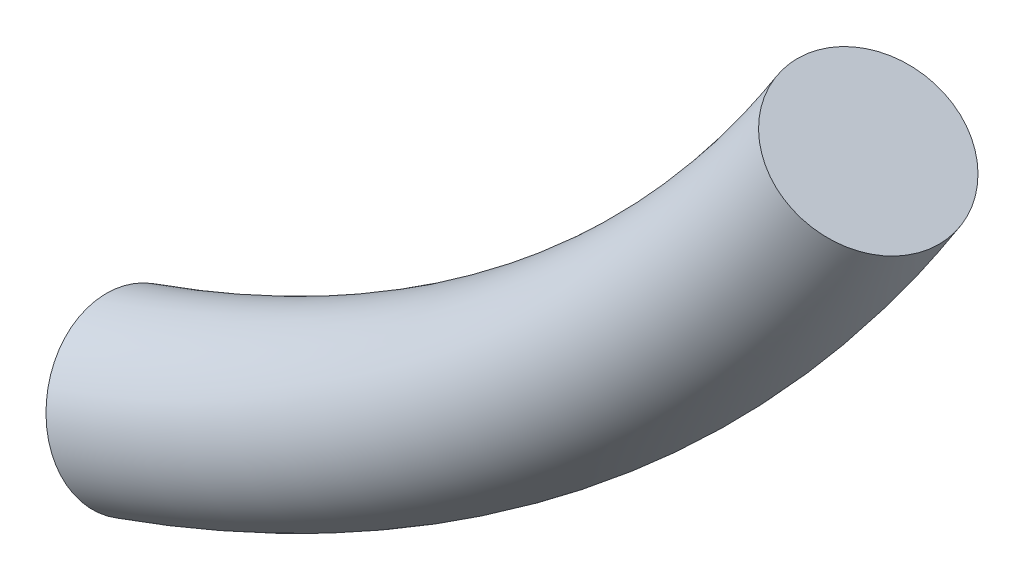
ISO-10303-21;
HEADER;
FILE_DESCRIPTION(('STEP AP214'),'2;1');
FILE_NAME('part.step','',(''),(''),'','','');
FILE_SCHEMA(('AUTOMOTIVE_DESIGN { 1 0 10303 214 1 1 1 1 }'));
ENDSEC;
DATA;
#1=APPLICATION_CONTEXT('core data for automotive mechanical design processes');
#2=APPLICATION_PROTOCOL_DEFINITION('international standard','automotive_design',2000,#1);
#3=PRODUCT_CONTEXT('',#1,'mechanical');
#4=PRODUCT('Part','Part','',(#3));
#5=PRODUCT_RELATED_PRODUCT_CATEGORY('part','',(#4));
#6=PRODUCT_DEFINITION_FORMATION('','',#4);
#7=PRODUCT_DEFINITION_CONTEXT('part definition',#1,'design');
#8=PRODUCT_DEFINITION('design','',#6,#7);
#9=PRODUCT_DEFINITION_SHAPE('','',#8);
#10=(LENGTH_UNIT() NAMED_UNIT(*) SI_UNIT(.MILLI.,.METRE.));
#11=(NAMED_UNIT(*) PLANE_ANGLE_UNIT() SI_UNIT($,.RADIAN.));
#12=(NAMED_UNIT(*) SI_UNIT($,.STERADIAN.) SOLID_ANGLE_UNIT());
#13=UNCERTAINTY_MEASURE_WITH_UNIT(LENGTH_MEASURE(1.E-05),#10,'distance_accuracy_value','');
#14=(GEOMETRIC_REPRESENTATION_CONTEXT(3) GLOBAL_UNCERTAINTY_ASSIGNED_CONTEXT((#13)) GLOBAL_UNIT_ASSIGNED_CONTEXT((#10,
#11,#12)) REPRESENTATION_CONTEXT('',''));
#15=CARTESIAN_POINT('',(0.,0.,0.));
#16=DIRECTION('',(0.,0.,1.));
#17=DIRECTION('',(1.,0.,0.));
#18=AXIS2_PLACEMENT_3D('',#15,#16,#17);
#19=CARTESIAN_POINT('',(0.,0.,-107.5));
#20=DIRECTION('',(-0.942862382947884,-0.333182422738413,0.));
#21=DIRECTION('',(0.333182422738413,-0.942862382947884,0.));
#22=AXIS2_PLACEMENT_3D('',#19,#20,#21);
#23=PLANE('',#22);
#24=CARTESIAN_POINT('',(2.41962933421589,-6.84723239947315,-102.2302));
#25=CARTESIAN_POINT('',(2.41962871926832,-6.84723065925251,-102.25265524156));
#26=CARTESIAN_POINT('',(2.41899700473931,-6.84544299031946,-102.275130857259));
#27=CARTESIAN_POINT('',(2.41648383930042,-6.83833106306059,-102.319482451298));
#28=CARTESIAN_POINT('',(2.41459971367299,-6.83299923563628,-102.341357041711));
#29=CARTESIAN_POINT('',(2.40963785801838,-6.81895783750999,-102.383809618347));
#30=CARTESIAN_POINT('',(2.40656225836532,-6.81025429548624,-102.404389843003));
#31=CARTESIAN_POINT('',(2.39929905568181,-6.78970038830917,-102.443737337222));
#32=CARTESIAN_POINT('',(2.39510987515017,-6.77784555903515,-102.46250198299));
#33=CARTESIAN_POINT('',(2.38574734664067,-6.75135083620936,-102.497627484938));
#34=CARTESIAN_POINT('',(2.38057539472916,-6.73671489334148,-102.513991693303));
#35=CARTESIAN_POINT('',(2.36938219244588,-6.70503960479868,-102.543904884907));
#36=CARTESIAN_POINT('',(2.36335976327552,-6.68799692327894,-102.557449895039));
#37=CARTESIAN_POINT('',(2.35064698076117,-6.65202142278026,-102.581301941874));
#38=CARTESIAN_POINT('',(2.34395711710098,-6.63308998954198,-102.5916113298));
#39=CARTESIAN_POINT('',(2.33009526466667,-6.59386277247914,-102.608713483024));
#40=CARTESIAN_POINT('',(2.32292324755682,-6.57356690846817,-102.615506041437));
#41=CARTESIAN_POINT('',(2.30830127034133,-6.53218863836769,-102.625380612929));
#42=CARTESIAN_POINT('',(2.30085131841581,-6.51110625542681,-102.628462735124));
#43=CARTESIAN_POINT('',(2.28588475233424,-6.46875284421071,-102.630829316177));
#44=CARTESIAN_POINT('',(2.27836813817819,-6.44748181593549,-102.630113775036));
#45=CARTESIAN_POINT('',(2.26348140012424,-6.40535430752582,-102.624905254934));
#46=CARTESIAN_POINT('',(2.25611128054104,-6.38449783960139,-102.620412164882));
#47=CARTESIAN_POINT('',(2.24172742311352,-6.34379341714529,-102.607776350926));
#48=CARTESIAN_POINT('',(2.23471366433335,-6.3239454033679,-102.599633841699));
#49=CARTESIAN_POINT('',(2.22123620327127,-6.28580596327187,-102.579923114515));
#50=CARTESIAN_POINT('',(2.21477290564648,-6.2675156820796,-102.568352403919));
#51=CARTESIAN_POINT('',(2.20259441310781,-6.23305215185689,-102.542134850302));
#52=CARTESIAN_POINT('',(2.19687818501873,-6.21687597907669,-102.527492330157));
#53=CARTESIAN_POINT('',(2.18633774988249,-6.18704793560373,-102.495513974748));
#54=CARTESIAN_POINT('',(2.18151481381394,-6.1733996616131,-102.478174365578));
#55=CARTESIAN_POINT('',(2.17291427173499,-6.1490612600475,-102.441335318358));
#56=CARTESIAN_POINT('',(2.16913518881484,-6.13836695301243,-102.421838987082));
#57=CARTESIAN_POINT('',(2.16271454541356,-6.120197377656,-102.381186262625));
#58=CARTESIAN_POINT('',(2.1600750251459,-6.11272788287008,-102.36002697154));
#59=CARTESIAN_POINT('',(2.15602303202312,-6.10126127589834,-102.316713490036));
#60=CARTESIAN_POINT('',(2.15460794784839,-6.09725677402189,-102.294561523395));
#61=CARTESIAN_POINT('',(2.15332930275961,-6.0936383767924,-102.258269762147));
#62=CARTESIAN_POINT('',(2.15308301156416,-6.09294140514085,-102.244238862858));
#63=CARTESIAN_POINT('',(2.15308401097272,-6.09294423333549,-102.20774475844));
#64=CARTESIAN_POINT('',(2.15371572550174,-6.09473190226854,-102.185269142741));
#65=CARTESIAN_POINT('',(2.15622889094062,-6.10184382952741,-102.140917548703));
#66=CARTESIAN_POINT('',(2.15811301656806,-6.10717565695172,-102.119042958289));
#67=CARTESIAN_POINT('',(2.16307487222267,-6.12121705507801,-102.076590381653));
#68=CARTESIAN_POINT('',(2.16615047187573,-6.12992059710176,-102.056010156997));
#69=CARTESIAN_POINT('',(2.17341367455923,-6.15047450427884,-102.016662662778));
#70=CARTESIAN_POINT('',(2.17760285509088,-6.16232933355285,-101.99789801701));
#71=CARTESIAN_POINT('',(2.18696538360038,-6.18882405637865,-101.962772515062));
#72=CARTESIAN_POINT('',(2.19213733551188,-6.20345999924652,-101.946408306697));
#73=CARTESIAN_POINT('',(2.20333053779516,-6.23513528778932,-101.916495115093));
#74=CARTESIAN_POINT('',(2.20935296696553,-6.25217796930906,-101.902950104961));
#75=CARTESIAN_POINT('',(2.22206574947988,-6.28815346980774,-101.879098058126));
#76=CARTESIAN_POINT('',(2.22875561314007,-6.30708490304603,-101.8687886702));
#77=CARTESIAN_POINT('',(2.24261746557437,-6.34631212010886,-101.851686516976));
#78=CARTESIAN_POINT('',(2.24978948268423,-6.36660798411983,-101.844893958563));
#79=CARTESIAN_POINT('',(2.26441145989971,-6.40798625422031,-101.835019387071));
#80=CARTESIAN_POINT('',(2.27186141182523,-6.42906863716119,-101.831937264876));
#81=CARTESIAN_POINT('',(2.28682797790681,-6.47142204837729,-101.829570683823));
#82=CARTESIAN_POINT('',(2.29434459206286,-6.49269307665252,-101.830286224964));
#83=CARTESIAN_POINT('',(2.30923133011681,-6.53482058506219,-101.835494745066));
#84=CARTESIAN_POINT('',(2.31660144970001,-6.55567705298661,-101.839987835118));
#85=CARTESIAN_POINT('',(2.33098530712752,-6.59638147544271,-101.852623649074));
#86=CARTESIAN_POINT('',(2.33799906590769,-6.6162294892201,-101.860766158301));
#87=CARTESIAN_POINT('',(2.35147652696978,-6.65436892931613,-101.880476885485));
#88=CARTESIAN_POINT('',(2.35793982459457,-6.6726592105084,-101.892047596081));
#89=CARTESIAN_POINT('',(2.37011831713323,-6.70712274073111,-101.918265149698));
#90=CARTESIAN_POINT('',(2.37583454522231,-6.72329891351131,-101.932907669844));
#91=CARTESIAN_POINT('',(2.38637498035855,-6.75312695698426,-101.964886025252));
#92=CARTESIAN_POINT('',(2.3911979164271,-6.7667752309749,-101.982225634422));
#93=CARTESIAN_POINT('',(2.39979845850606,-6.7911136325405,-102.019064681642));
#94=CARTESIAN_POINT('',(2.40357754142621,-6.80180793957556,-102.038561012918));
#95=CARTESIAN_POINT('',(2.40999818482748,-6.81997751493199,-102.079213737375));
#96=CARTESIAN_POINT('',(2.41263770509514,-6.82744700971792,-102.10037302846));
#97=CARTESIAN_POINT('',(2.41668969821792,-6.83891361668966,-102.143686509964));
#98=CARTESIAN_POINT('',(2.41810478239265,-6.84291811856611,-102.165838476605));
#99=CARTESIAN_POINT('',(2.41938342748143,-6.8465365157956,-102.202130237853));
#100=CARTESIAN_POINT('',(2.41962971867688,-6.84723348744715,-102.216161137143));
#101=CARTESIAN_POINT('',(2.41962933421589,-6.84723239947315,-102.2302));
#102=B_SPLINE_CURVE_WITH_KNOTS('',3,(#24,#25,#26,#27,#28,#29,#30,#31,#32,#33,#34,#35,#36,#37,
#38,#39,#40,#41,#42,#43,#44,#45,#46,#47,#48,#49,#50,#51,#52,#53,#54,#55,#56,#57,#58,#59,#60,#61,
#62,#63,#64,#65,#66,#67,#68,#69,#70,#71,#72,#73,#74,#75,#76,#77,#78,#79,#80,#81,#82,#83,#84,#85,
#86,#87,#88,#89,#90,#91,#92,#93,#94,#95,#96,#97,#98,#99,#100,#101),.UNSPECIFIED.,.T.,.F.,(4,2,2,
2,2,2,2,2,2,2,2,2,2,2,2,2,2,2,2,2,2,2,2,2,2,2,2,2,2,2,2,2,2,2,2,2,2,2,4),(0.,0.0673217190940812,
0.134787678055445,0.202133559490878,0.26957535641861,0.336922056232666,0.404363034793443,
0.471754892083641,0.539150713403541,0.606544552708794,0.673938392014053,0.741334213333949,
0.808726070624146,0.876167049184932,0.943513748998995,1.01095554592845,1.07830142736559,
1.1457673863287,1.21308910542448,1.25517818200734,1.32249990110141,1.3899658600628,
1.45731174149823,1.52475353842596,1.59210023824002,1.6595412168008,1.726933074091,
1.79432889541089,1.86172273471615,1.92911657402141,1.99651239534131,2.0639042526315,
2.13134523119228,2.19869193100635,2.26613372793577,2.33347960937293,2.40094556833603,
2.46826728743183,2.51035636401471),.UNSPECIFIED.);
#103=CARTESIAN_POINT('',(2.41962933421589,-6.84723239947315,-102.2302));
#104=VERTEX_POINT('',#103);
#105=EDGE_CURVE('E18',#104,#104,#102,.T.);
#106=ORIENTED_EDGE('',*,*,#105,.F.);
#107=EDGE_LOOP('',(#106));
#108=FACE_BOUND('',#107,.T.);
#109=ADVANCED_FACE('F14',(#108),#23,.T.);
#110=CARTESIAN_POINT('',(0.,0.,-107.5));
#111=DIRECTION('',(-0.537858114998482,-0.843035377745371,0.));
#112=DIRECTION('',(0.843035377745371,-0.537858114998482,0.));
#113=AXIS2_PLACEMENT_3D('',#110,#111,#112);
#114=PLANE('',#113);
#115=CARTESIAN_POINT('',(5.44784283386539,-3.4757337055858,-102.2302));
#116=CARTESIAN_POINT('',(5.44784438983749,-3.47573469829885,-102.25265524156));
#117=CARTESIAN_POINT('',(5.44944278657228,-3.47675447834307,-102.275130857259));
#118=CARTESIAN_POINT('',(5.45580172759232,-3.48081149436009,-102.319482451298));
#119=CARTESIAN_POINT('',(5.46056903958612,-3.48385304814333,-102.341357041711));
#120=CARTESIAN_POINT('',(5.47312378308586,-3.49186299748985,-102.383809618347));
#121=CARTESIAN_POINT('',(5.48090582420916,-3.49682795397912,-102.404389843003));
#122=CARTESIAN_POINT('',(5.49928355484573,-3.50855297978358,-102.443737337222));
#123=CARTESIAN_POINT('',(5.50988323583404,-3.51531559566715,-102.46250198299));
#124=CARTESIAN_POINT('',(5.53357278912374,-3.53042957405277,-102.497627484938));
#125=CARTESIAN_POINT('',(5.54665912902597,-3.53877868287767,-102.513991693303));
#126=CARTESIAN_POINT('',(5.57498074766812,-3.55684792744166,-102.543904884907));
#127=CARTESIAN_POINT('',(5.59021900906515,-3.56656996612143,-102.557449895039));
#128=CARTESIAN_POINT('',(5.62238554810731,-3.5870922769425,-102.581301941874));
#129=CARTESIAN_POINT('',(5.63931258672922,-3.5978917585847,-102.5916113298));
#130=CARTESIAN_POINT('',(5.67438656184218,-3.62026901894382,-102.608713483024));
#131=CARTESIAN_POINT('',(5.6925335700298,-3.63184684340329,-102.615506041437));
#132=CARTESIAN_POINT('',(5.72953085213108,-3.65545117714345,-102.625380612929));
#133=CARTESIAN_POINT('',(5.74838110534701,-3.66747767321895,-102.628462735124));
#134=CARTESIAN_POINT('',(5.78625028399824,-3.69163827855483,-102.630829316177));
#135=CARTESIAN_POINT('',(5.80526920943354,-3.7037723878152,-102.630113775036));
#136=CARTESIAN_POINT('',(5.84293640308547,-3.7278041263516,-102.624905254934));
#137=CARTESIAN_POINT('',(5.86158466038483,-3.73970174866239,-102.620412164882));
#138=CARTESIAN_POINT('',(5.89797943949765,-3.76292168439244,-102.607776350926));
#139=CARTESIAN_POINT('',(5.91572601428411,-3.77424403160858,-102.599633841699));
#140=CARTESIAN_POINT('',(5.94982738248997,-3.79600076697967,-102.579923114515));
#141=CARTESIAN_POINT('',(5.96618115202501,-3.80643450189452,-102.568352403919));
#142=CARTESIAN_POINT('',(5.99699580297005,-3.82609430563367,-102.542134850302));
#143=CARTESIAN_POINT('',(6.01145929857328,-3.83532204231805,-102.527492330157));
#144=CARTESIAN_POINT('',(6.03812925205898,-3.85233752148723,-102.495513974748));
#145=CARTESIAN_POINT('',(6.05033249404568,-3.86012321222466,-102.478174365578));
#146=CARTESIAN_POINT('',(6.07209402990568,-3.87400711195902,-102.441335318358));
#147=CARTESIAN_POINT('',(6.08165606073233,-3.88010770513902,-102.421838987082));
#148=CARTESIAN_POINT('',(6.09790190434759,-3.89047258311939,-102.381186262625));
#149=CARTESIAN_POINT('',(6.10458055488271,-3.89473357439257,-102.36002697154));
#150=CARTESIAN_POINT('',(6.1148331172022,-3.9012747279297,-102.316713490036));
#151=CARTESIAN_POINT('',(6.11841363628234,-3.90355910566046,-102.294561523395));
#152=CARTESIAN_POINT('',(6.12164893013897,-3.90562322906634,-102.258269762147));
#153=CARTESIAN_POINT('',(6.12227210884476,-3.90602081822197,-102.244238862858));
#154=CARTESIAN_POINT('',(6.12226958008958,-3.90601920487153,-102.20774475844));
#155=CARTESIAN_POINT('',(6.12067118335479,-3.90499942482732,-102.185269142741));
#156=CARTESIAN_POINT('',(6.11431224233475,-3.9009424088103,-102.140917548703));
#157=CARTESIAN_POINT('',(6.10954493034095,-3.89790085502705,-102.119042958289));
#158=CARTESIAN_POINT('',(6.09699018684121,-3.88989090568053,-102.076590381653));
#159=CARTESIAN_POINT('',(6.08920814571791,-3.88492594919127,-102.056010156997));
#160=CARTESIAN_POINT('',(6.07083041508134,-3.87320092338681,-102.016662662778));
#161=CARTESIAN_POINT('',(6.06023073409303,-3.86643830750323,-101.99789801701));
#162=CARTESIAN_POINT('',(6.03654118080332,-3.85132432911761,-101.962772515062));
#163=CARTESIAN_POINT('',(6.0234548409011,-3.84297522029271,-101.946408306697));
#164=CARTESIAN_POINT('',(5.99513322225895,-3.82490597572873,-101.916495115093));
#165=CARTESIAN_POINT('',(5.97989496086192,-3.81518393704895,-101.902950104961));
#166=CARTESIAN_POINT('',(5.94772842181975,-3.79466162622788,-101.879098058126));
#167=CARTESIAN_POINT('',(5.93080138319785,-3.78386214458569,-101.8687886702));
#168=CARTESIAN_POINT('',(5.89572740808488,-3.76148488422656,-101.851686516976));
#169=CARTESIAN_POINT('',(5.87758039989726,-3.74990705976709,-101.844893958563));
#170=CARTESIAN_POINT('',(5.84058311779598,-3.72630272602693,-101.835019387071));
#171=CARTESIAN_POINT('',(5.82173286458005,-3.71427622995143,-101.831937264876));
#172=CARTESIAN_POINT('',(5.78386368592883,-3.69011562461556,-101.829570683823));
#173=CARTESIAN_POINT('',(5.76484476049353,-3.67798151535518,-101.830286224964));
#174=CARTESIAN_POINT('',(5.7271775668416,-3.65394977681878,-101.835494745066));
#175=CARTESIAN_POINT('',(5.70852930954224,-3.642052154508,-101.839987835118));
#176=CARTESIAN_POINT('',(5.67213453042941,-3.61883221877794,-101.852623649074));
#177=CARTESIAN_POINT('',(5.65438795564296,-3.6075098715618,-101.860766158301));
#178=CARTESIAN_POINT('',(5.6202865874371,-3.58575313619072,-101.880476885485));
#179=CARTESIAN_POINT('',(5.60393281790205,-3.57531940127586,-101.892047596081));
#180=CARTESIAN_POINT('',(5.57311816695702,-3.55565959753671,-101.918265149698));
#181=CARTESIAN_POINT('',(5.55865467135378,-3.54643186085234,-101.932907669844));
#182=CARTESIAN_POINT('',(5.53198471786809,-3.52941638168315,-101.964886025252));
#183=CARTESIAN_POINT('',(5.51978147588139,-3.52163069094573,-101.982225634422));
#184=CARTESIAN_POINT('',(5.49801994002138,-3.50774679121136,-102.019064681642));
#185=CARTESIAN_POINT('',(5.48845790919474,-3.50164619803136,-102.038561012918));
#186=CARTESIAN_POINT('',(5.47221206557948,-3.49128132005099,-102.079213737375));
#187=CARTESIAN_POINT('',(5.46553341504436,-3.48702032877781,-102.10037302846));
#188=CARTESIAN_POINT('',(5.45528085272486,-3.48047917524068,-102.143686509964));
#189=CARTESIAN_POINT('',(5.45170033364472,-3.47819479750993,-102.165838476605));
#190=CARTESIAN_POINT('',(5.4484650397881,-3.47613067410404,-102.202130237853));
#191=CARTESIAN_POINT('',(5.44784186108231,-3.47573308494841,-102.216161137143));
#192=CARTESIAN_POINT('',(5.44784283386539,-3.4757337055858,-102.2302));
#193=B_SPLINE_CURVE_WITH_KNOTS('',3,(#115,#116,#117,#118,#119,#120,#121,#122,#123,#124,#125,
#126,#127,#128,#129,#130,#131,#132,#133,#134,#135,#136,#137,#138,#139,#140,#141,#142,#143,#144,
#145,#146,#147,#148,#149,#150,#151,#152,#153,#154,#155,#156,#157,#158,#159,#160,#161,#162,#163,
#164,#165,#166,#167,#168,#169,#170,#171,#172,#173,#174,#175,#176,#177,#178,#179,#180,#181,#182,
#183,#184,#185,#186,#187,#188,#189,#190,#191,#192),.UNSPECIFIED.,.T.,.F.,(4,2,2,2,2,2,2,2,2,2,2,
2,2,2,2,2,2,2,2,2,2,2,2,2,2,2,2,2,2,2,2,2,2,2,2,2,2,2,4),(0.,0.0673217190940812,
0.134787678055445,0.202133559490878,0.269575356418609,0.336922056232666,0.404363034793442,
0.47175489208364,0.53915071340354,0.606544552708795,0.673938392014054,0.741334213333952,
0.808726070624148,0.876167049184934,0.943513748998997,1.01095554592845,1.07830142736559,
1.1457673863287,1.21308910542448,1.25517818200734,1.32249990110141,1.3899658600628,
1.45731174149823,1.52475353842597,1.59210023824002,1.6595412168008,1.726933074091,
1.7943288954109,1.86172273471615,1.92911657402141,1.99651239534131,2.0639042526315,
2.13134523119229,2.19869193100635,2.2661337279358,2.33347960937294,2.40094556833606,
2.46826728743184,2.51035636401471),.UNSPECIFIED.);
#194=CARTESIAN_POINT('',(5.44784283386539,-3.4757337055858,-102.2302));
#195=VERTEX_POINT('',#194);
#196=EDGE_CURVE('E10',#195,#195,#193,.T.);
#197=ORIENTED_EDGE('',*,*,#196,.F.);
#198=EDGE_LOOP('',(#197));
#199=FACE_BOUND('',#198,.T.);
#200=ADVANCED_FACE('F34',(#199),#114,.F.);
#201=CARTESIAN_POINT('',(0.,0.,-102.2302));
#202=DIRECTION('',(0.,0.,1.));
#203=DIRECTION('',(-0.942862382947884,-0.333182422738413,0.));
#204=AXIS2_PLACEMENT_3D('',#201,#202,#203);
#205=TOROIDAL_SURFACE('',#204,6.86217582046821,0.4);
#206=ORIENTED_EDGE('',*,*,#105,.T.);
#207=EDGE_LOOP('',(#206));
#208=FACE_BOUND('',#207,.T.);
#209=ORIENTED_EDGE('',*,*,#196,.T.);
#210=EDGE_LOOP('',(#209));
#211=FACE_BOUND('',#210,.T.);
#212=ADVANCED_FACE('F36',(#208,#211),#205,.T.);
#213=CLOSED_SHELL('',(#109,#200,#212));
#214=MANIFOLD_SOLID_BREP('B1',#213);
#215=ADVANCED_BREP_SHAPE_REPRESENTATION('',(#18,#214),#14);
#216=SHAPE_DEFINITION_REPRESENTATION(#9,#215);
ENDSEC;
END-ISO-10303-21;
